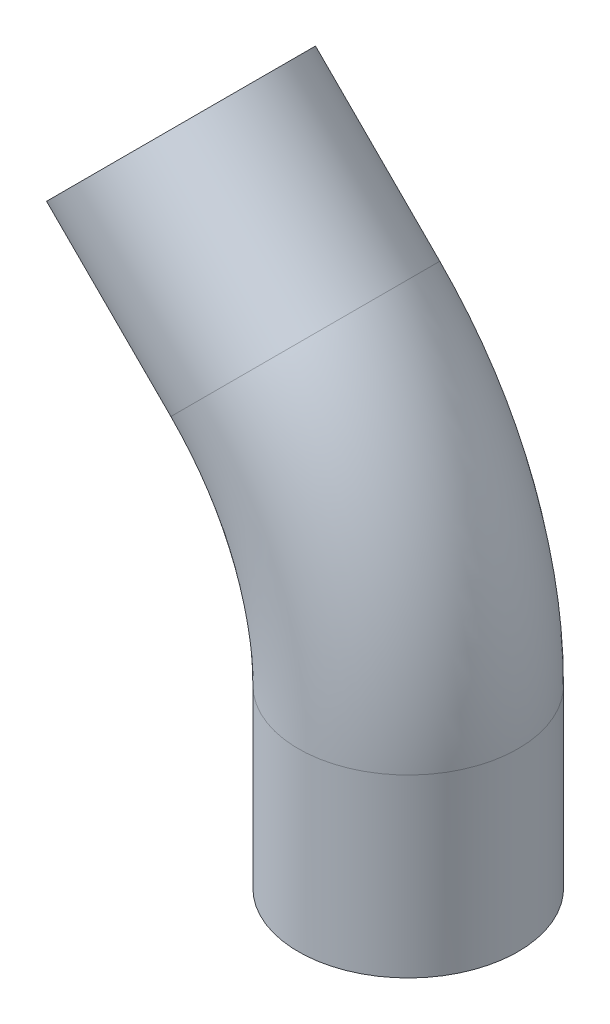
ISO-10303-21;
HEADER;
FILE_DESCRIPTION(('STEP AP214'),'2;1');
FILE_NAME('part.step','',(''),(''),'','','');
FILE_SCHEMA(('AUTOMOTIVE_DESIGN { 1 0 10303 214 1 1 1 1 }'));
ENDSEC;
DATA;
#1=APPLICATION_CONTEXT('core data for automotive mechanical design processes');
#2=APPLICATION_PROTOCOL_DEFINITION('international standard','automotive_design',2000,#1);
#3=PRODUCT_CONTEXT('',#1,'mechanical');
#4=PRODUCT('Part','Part','',(#3));
#5=PRODUCT_RELATED_PRODUCT_CATEGORY('part','',(#4));
#6=PRODUCT_DEFINITION_FORMATION('','',#4);
#7=PRODUCT_DEFINITION_CONTEXT('part definition',#1,'design');
#8=PRODUCT_DEFINITION('design','',#6,#7);
#9=PRODUCT_DEFINITION_SHAPE('','',#8);
#10=(LENGTH_UNIT() NAMED_UNIT(*) SI_UNIT(.MILLI.,.METRE.));
#11=(NAMED_UNIT(*) PLANE_ANGLE_UNIT() SI_UNIT($,.RADIAN.));
#12=(NAMED_UNIT(*) SI_UNIT($,.STERADIAN.) SOLID_ANGLE_UNIT());
#13=UNCERTAINTY_MEASURE_WITH_UNIT(LENGTH_MEASURE(1.E-05),#10,'distance_accuracy_value','');
#14=(GEOMETRIC_REPRESENTATION_CONTEXT(3) GLOBAL_UNCERTAINTY_ASSIGNED_CONTEXT((#13)) GLOBAL_UNIT_ASSIGNED_CONTEXT((#10,
#11,#12)) REPRESENTATION_CONTEXT('',''));
#15=CARTESIAN_POINT('',(0.,0.,0.));
#16=DIRECTION('',(0.,0.,1.));
#17=DIRECTION('',(1.,0.,0.));
#18=AXIS2_PLACEMENT_3D('',#15,#16,#17);
#19=CARTESIAN_POINT('',(-51.7157287525377,84.8528137423855,0.));
#20=DIRECTION('',(0.707106781186544,-0.707106781186551,0.));
#21=DIRECTION('',(0.,0.,-1.));
#22=AXIS2_PLACEMENT_3D('',#19,#20,#21);
#23=PLANE('',#22);
#24=CARTESIAN_POINT('',(-51.7157287525377,84.8528137423855,0.));
#25=DIRECTION('',(0.707106781186544,-0.707106781186551,0.));
#26=DIRECTION('',(0.707106781186551,0.707106781186544,0.));
#27=AXIS2_PLACEMENT_3D('',#24,#25,#26);
#28=CIRCLE('',#27,20.);
#29=CARTESIAN_POINT('',(-37.5735931288066,98.9949493661164,0.));
#30=VERTEX_POINT('',#29);
#31=EDGE_CURVE('E68',#30,#30,#28,.T.);
#32=ORIENTED_EDGE('',*,*,#31,.T.);
#33=EDGE_LOOP('',(#32));
#34=FACE_BOUND('',#33,.T.);
#35=CARTESIAN_POINT('',(-51.7157287525377,84.8528137423855,0.));
#36=DIRECTION('',(0.707106781186544,-0.707106781186551,0.));
#37=DIRECTION('',(0.,0.,-1.));
#38=AXIS2_PLACEMENT_3D('',#35,#36,#37);
#39=CIRCLE('',#38,25.);
#40=CARTESIAN_POINT('',(-51.7157287525377,84.8528137423855,-25.));
#41=VERTEX_POINT('',#40);
#42=EDGE_CURVE('E45',#41,#41,#39,.T.);
#43=ORIENTED_EDGE('',*,*,#42,.F.);
#44=EDGE_LOOP('',(#43));
#45=FACE_BOUND('',#44,.T.);
#46=ADVANCED_FACE('F33',(#34,#45),#23,.F.);
#47=CARTESIAN_POINT('',(0.,-40.,0.));
#48=DIRECTION('',(0.,-1.,0.));
#49=DIRECTION('',(0.,0.,-1.));
#50=AXIS2_PLACEMENT_3D('',#47,#48,#49);
#51=PLANE('',#50);
#52=CARTESIAN_POINT('',(0.,-40.,0.));
#53=DIRECTION('',(0.,-1.,0.));
#54=DIRECTION('',(0.,0.,-1.));
#55=AXIS2_PLACEMENT_3D('',#52,#53,#54);
#56=CIRCLE('',#55,20.);
#57=CARTESIAN_POINT('',(0.,-40.,-20.));
#58=VERTEX_POINT('',#57);
#59=EDGE_CURVE('E64',#58,#58,#56,.T.);
#60=ORIENTED_EDGE('',*,*,#59,.F.);
#61=EDGE_LOOP('',(#60));
#62=FACE_BOUND('',#61,.T.);
#63=CARTESIAN_POINT('',(0.,-40.,0.));
#64=DIRECTION('',(0.,-1.,0.));
#65=DIRECTION('',(0.,0.,-1.));
#66=AXIS2_PLACEMENT_3D('',#63,#64,#65);
#67=CIRCLE('',#66,25.);
#68=CARTESIAN_POINT('',(0.,-40.,-25.));
#69=VERTEX_POINT('',#68);
#70=EDGE_CURVE('E11',#69,#69,#67,.T.);
#71=ORIENTED_EDGE('',*,*,#70,.T.);
#72=EDGE_LOOP('',(#71));
#73=FACE_BOUND('',#72,.T.);
#74=ADVANCED_FACE('F48',(#62,#73),#51,.T.);
#75=CARTESIAN_POINT('',(-51.7157287525377,84.8528137423855,0.));
#76=DIRECTION('',(0.707106781186544,-0.707106781186551,0.));
#77=DIRECTION('',(0.707106781186551,0.707106781186544,0.));
#78=AXIS2_PLACEMENT_3D('',#75,#76,#77);
#79=CYLINDRICAL_SURFACE('',#78,25.);
#80=CARTESIAN_POINT('',(-23.4314575050759,56.5685424949235,0.));
#81=DIRECTION('',(0.707106781186544,-0.707106781186551,0.));
#82=DIRECTION('',(0.,0.,-1.));
#83=AXIS2_PLACEMENT_3D('',#80,#81,#82);
#84=CIRCLE('',#83,25.);
#85=CARTESIAN_POINT('',(-5.75378797541212,74.2462120245871,0.));
#86=VERTEX_POINT('',#85);
#87=EDGE_CURVE('E59',#86,#86,#84,.T.);
#88=ORIENTED_EDGE('',*,*,#87,.F.);
#89=EDGE_LOOP('',(#88));
#90=FACE_BOUND('',#89,.T.);
#91=ORIENTED_EDGE('',*,*,#42,.T.);
#92=EDGE_LOOP('',(#91));
#93=FACE_BOUND('',#92,.T.);
#94=ADVANCED_FACE('F92',(#90,#93),#79,.T.);
#95=CARTESIAN_POINT('',(-80.,0.,0.));
#96=DIRECTION('',(0.,0.,-1.));
#97=DIRECTION('',(-1.,0.,0.));
#98=AXIS2_PLACEMENT_3D('',#95,#96,#97);
#99=TOROIDAL_SURFACE('',#98,80.,25.);
#100=CARTESIAN_POINT('',(0.,0.,0.));
#101=DIRECTION('',(0.,-1.,0.));
#102=DIRECTION('',(0.,0.,-1.));
#103=AXIS2_PLACEMENT_3D('',#100,#101,#102);
#104=CIRCLE('',#103,25.);
#105=CARTESIAN_POINT('',(25.,0.,0.));
#106=VERTEX_POINT('',#105);
#107=EDGE_CURVE('E40',#106,#106,#104,.T.);
#108=CARTESIAN_POINT('',(-80.,0.,0.));
#109=DIRECTION('',(0.,0.,-1.));
#110=DIRECTION('',(-1.,0.,0.));
#111=AXIS2_PLACEMENT_3D('',#108,#109,#110);
#112=CIRCLE('',#111,105.);
#113=EDGE_CURVE('',#86,#106,#112,.T.);
#114=ORIENTED_EDGE('',*,*,#87,.T.);
#115=ORIENTED_EDGE('',*,*,#107,.F.);
#116=ORIENTED_EDGE('',*,*,#113,.T.);
#117=ORIENTED_EDGE('',*,*,#113,.F.);
#118=EDGE_LOOP('',(#114,#116,#115,#117));
#119=FACE_BOUND('',#118,.T.);
#120=ADVANCED_FACE('F54',(#119),#99,.T.);
#121=CARTESIAN_POINT('',(0.,0.,0.));
#122=DIRECTION('',(0.,-1.,0.));
#123=DIRECTION('',(0.,0.,-1.));
#124=AXIS2_PLACEMENT_3D('',#121,#122,#123);
#125=CYLINDRICAL_SURFACE('',#124,25.);
#126=ORIENTED_EDGE('',*,*,#70,.F.);
#127=EDGE_LOOP('',(#126));
#128=FACE_BOUND('',#127,.T.);
#129=ORIENTED_EDGE('',*,*,#107,.T.);
#130=EDGE_LOOP('',(#129));
#131=FACE_BOUND('',#130,.T.);
#132=ADVANCED_FACE('F50',(#128,#131),#125,.T.);
#133=CARTESIAN_POINT('',(-51.7157287525377,84.8528137423855,0.));
#134=DIRECTION('',(0.707106781186544,-0.707106781186551,0.));
#135=DIRECTION('',(0.707106781186551,0.707106781186544,0.));
#136=AXIS2_PLACEMENT_3D('',#133,#134,#135);
#137=CYLINDRICAL_SURFACE('',#136,20.);
#138=CARTESIAN_POINT('',(-23.4314575050759,56.5685424949235,0.));
#139=DIRECTION('',(-0.707106781186544,0.707106781186551,0.));
#140=DIRECTION('',(-0.707106781186551,-0.707106781186544,0.));
#141=AXIS2_PLACEMENT_3D('',#138,#139,#140);
#142=CIRCLE('',#141,20.);
#143=CARTESIAN_POINT('',(-9.28932188134486,70.7106781186544,0.));
#144=VERTEX_POINT('',#143);
#145=EDGE_CURVE('E71',#144,#144,#142,.F.);
#146=ORIENTED_EDGE('',*,*,#145,.T.);
#147=EDGE_LOOP('',(#146));
#148=FACE_BOUND('',#147,.T.);
#149=ORIENTED_EDGE('',*,*,#31,.F.);
#150=EDGE_LOOP('',(#149));
#151=FACE_BOUND('',#150,.T.);
#152=ADVANCED_FACE('F53',(#148,#151),#137,.F.);
#153=CARTESIAN_POINT('',(-80.,0.,0.));
#154=DIRECTION('',(0.,0.,-1.));
#155=DIRECTION('',(-1.,0.,0.));
#156=AXIS2_PLACEMENT_3D('',#153,#154,#155);
#157=TOROIDAL_SURFACE('',#156,80.,20.);
#158=CARTESIAN_POINT('',(0.,0.,0.));
#159=DIRECTION('',(0.,-1.,0.));
#160=DIRECTION('',(0.,0.,-1.));
#161=AXIS2_PLACEMENT_3D('',#158,#159,#160);
#162=CIRCLE('',#161,20.);
#163=CARTESIAN_POINT('',(20.,0.,0.));
#164=VERTEX_POINT('',#163);
#165=EDGE_CURVE('E67',#164,#164,#162,.T.);
#166=CARTESIAN_POINT('',(-80.,0.,0.));
#167=DIRECTION('',(0.,0.,-1.));
#168=DIRECTION('',(-1.,0.,0.));
#169=AXIS2_PLACEMENT_3D('',#166,#167,#168);
#170=CIRCLE('',#169,100.);
#171=EDGE_CURVE('',#144,#164,#170,.T.);
#172=ORIENTED_EDGE('',*,*,#145,.F.);
#173=ORIENTED_EDGE('',*,*,#165,.T.);
#174=ORIENTED_EDGE('',*,*,#171,.T.);
#175=ORIENTED_EDGE('',*,*,#171,.F.);
#176=EDGE_LOOP('',(#172,#174,#173,#175));
#177=FACE_BOUND('',#176,.T.);
#178=ADVANCED_FACE('F79',(#177),#157,.F.);
#179=CARTESIAN_POINT('',(0.,0.,0.));
#180=DIRECTION('',(0.,-1.,0.));
#181=DIRECTION('',(0.,0.,-1.));
#182=AXIS2_PLACEMENT_3D('',#179,#180,#181);
#183=CYLINDRICAL_SURFACE('',#182,20.);
#184=ORIENTED_EDGE('',*,*,#59,.T.);
#185=EDGE_LOOP('',(#184));
#186=FACE_BOUND('',#185,.T.);
#187=ORIENTED_EDGE('',*,*,#165,.F.);
#188=EDGE_LOOP('',(#187));
#189=FACE_BOUND('',#188,.T.);
#190=ADVANCED_FACE('F81',(#186,#189),#183,.F.);
#191=CLOSED_SHELL('',(#46,#74,#94,#120,#132,#152,#178,#190));
#192=MANIFOLD_SOLID_BREP('B2',#191);
#193=ADVANCED_BREP_SHAPE_REPRESENTATION('',(#18,#192),#14);
#194=SHAPE_DEFINITION_REPRESENTATION(#9,#193);
ENDSEC;
END-ISO-10303-21;
